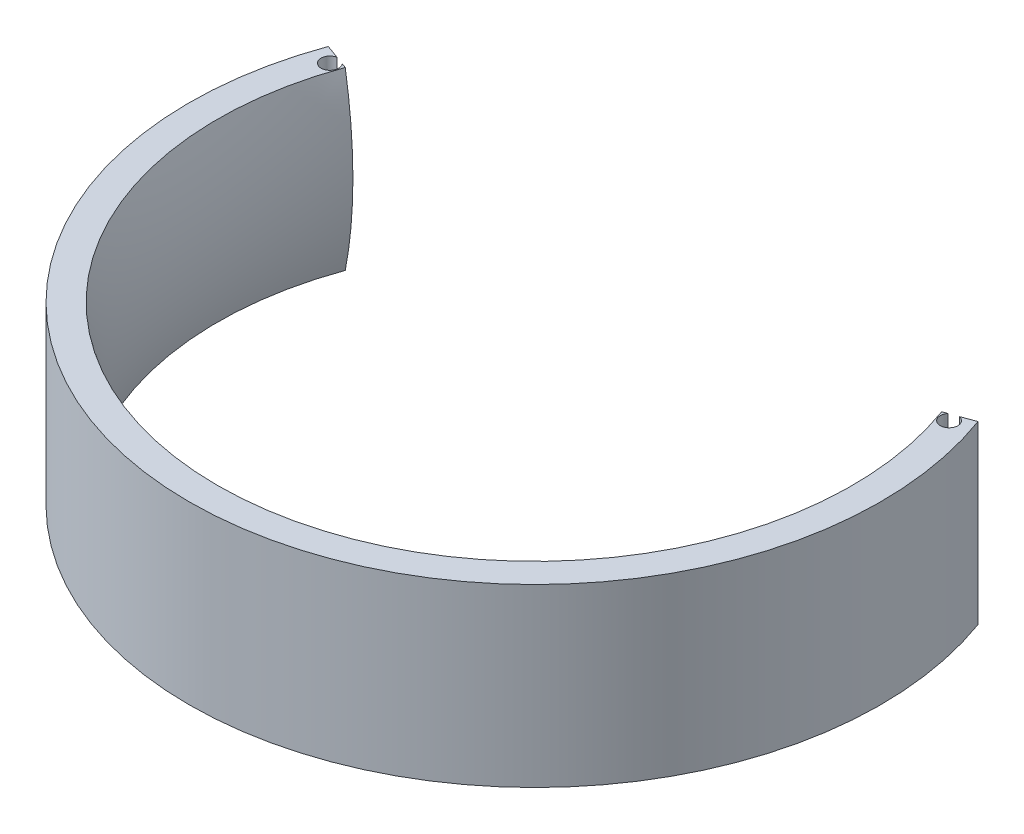
ISO-10303-21;
HEADER;
FILE_DESCRIPTION(('STEP AP214'),'2;1');
FILE_NAME('part.step','',(''),(''),'','','');
FILE_SCHEMA(('AUTOMOTIVE_DESIGN { 1 0 10303 214 1 1 1 1 }'));
ENDSEC;
DATA;
#1=APPLICATION_CONTEXT('core data for automotive mechanical design processes');
#2=APPLICATION_PROTOCOL_DEFINITION('international standard','automotive_design',2000,#1);
#3=PRODUCT_CONTEXT('',#1,'mechanical');
#4=PRODUCT('Part','Part','',(#3));
#5=PRODUCT_RELATED_PRODUCT_CATEGORY('part','',(#4));
#6=PRODUCT_DEFINITION_FORMATION('','',#4);
#7=PRODUCT_DEFINITION_CONTEXT('part definition',#1,'design');
#8=PRODUCT_DEFINITION('design','',#6,#7);
#9=PRODUCT_DEFINITION_SHAPE('','',#8);
#10=(LENGTH_UNIT() NAMED_UNIT(*) SI_UNIT(.MILLI.,.METRE.));
#11=(NAMED_UNIT(*) PLANE_ANGLE_UNIT() SI_UNIT($,.RADIAN.));
#12=(NAMED_UNIT(*) SI_UNIT($,.STERADIAN.) SOLID_ANGLE_UNIT());
#13=UNCERTAINTY_MEASURE_WITH_UNIT(LENGTH_MEASURE(1.E-05),#10,'distance_accuracy_value','');
#14=(GEOMETRIC_REPRESENTATION_CONTEXT(3) GLOBAL_UNCERTAINTY_ASSIGNED_CONTEXT((#13)) GLOBAL_UNIT_ASSIGNED_CONTEXT((#10,
#11,#12)) REPRESENTATION_CONTEXT('',''));
#15=CARTESIAN_POINT('',(0.,0.,0.));
#16=DIRECTION('',(0.,0.,1.));
#17=DIRECTION('',(1.,0.,0.));
#18=AXIS2_PLACEMENT_3D('',#15,#16,#17);
#19=CARTESIAN_POINT('',(-34.4526721427708,-10.,-12.5397471509011));
#20=DIRECTION('',(0.342020143325668,0.,-0.939692620785909));
#21=DIRECTION('',(-0.939692620785909,0.,-0.342020143325668));
#22=AXIS2_PLACEMENT_3D('',#19,#20,#21);
#23=PLANE('',#22);
#24=DIRECTION('',(-0.939692620785909,0.,-0.342020143325668));
#25=VECTOR('',#24,1.);
#26=CARTESIAN_POINT('',(-34.4526721427708,10.,-12.5397471509011));
#27=LINE('',#26,#25);
#28=CARTESIAN_POINT('',(-33.9229003109984,10.,-12.3469259731833));
#29=VERTEX_POINT('',#28);
#30=CARTESIAN_POINT('',(-34.4526721427708,10.,-12.5397471509011));
#31=VERTEX_POINT('',#30);
#32=EDGE_CURVE('E117',#29,#31,#27,.T.);
#33=ORIENTED_EDGE('',*,*,#32,.F.);
#34=CARTESIAN_POINT('',(-65.4411489814816,0.,-23.8186303254396));
#35=DIRECTION('',(0.342020143325673,0.,-0.939692620785907));
#36=DIRECTION('',(-0.939692620785907,0.,-0.342020143325673));
#37=AXIS2_PLACEMENT_3D('',#34,#35,#36);
#38=CIRCLE('',#37,35.);
#39=CARTESIAN_POINT('',(-33.9229003109983,-9.99999999999997,-12.3469259731833));
#40=VERTEX_POINT('',#39);
#41=EDGE_CURVE('E57',#29,#40,#38,.T.);
#42=ORIENTED_EDGE('',*,*,#41,.T.);
#43=DIRECTION('',(-0.939692620785909,0.,-0.342020143325668));
#44=VECTOR('',#43,1.);
#45=CARTESIAN_POINT('',(-34.4526721427708,-10.,-12.5397471509011));
#46=LINE('',#45,#44);
#47=CARTESIAN_POINT('',(-34.4526721427708,-10.,-12.5397471509011));
#48=VERTEX_POINT('',#47);
#49=EDGE_CURVE('E140',#40,#48,#46,.T.);
#50=ORIENTED_EDGE('',*,*,#49,.T.);
#51=DIRECTION('',(0.,1.,0.));
#52=VECTOR('',#51,1.);
#53=CARTESIAN_POINT('',(-34.4526721427708,-10.,-12.5397471509011));
#54=LINE('',#53,#52);
#55=EDGE_CURVE('E149',#48,#31,#54,.T.);
#56=ORIENTED_EDGE('',*,*,#55,.T.);
#57=EDGE_LOOP('',(#33,#42,#50,#56));
#58=FACE_BOUND('',#57,.T.);
#59=ADVANCED_FACE('F35',(#58),#23,.T.);
#60=CARTESIAN_POINT('',(32.8892417275068,-10.,-11.9707050163985));
#61=DIRECTION('',(-0.342020143325673,0.,-0.939692620785907));
#62=DIRECTION('',(-0.939692620785907,0.,0.342020143325673));
#63=AXIS2_PLACEMENT_3D('',#60,#61,#62);
#64=PLANE('',#63);
#65=DIRECTION('',(-0.939692620785907,0.,0.342020143325673));
#66=VECTOR('',#65,1.);
#67=CARTESIAN_POINT('',(32.8892417275068,-10.,-11.9707050163985));
#68=LINE('',#67,#66);
#69=CARTESIAN_POINT('',(34.4526721427708,-10.,-12.5397471509011));
#70=VERTEX_POINT('',#69);
#71=CARTESIAN_POINT('',(33.9229003109983,-10.,-12.3469259731833));
#72=VERTEX_POINT('',#71);
#73=EDGE_CURVE('E110',#70,#72,#68,.T.);
#74=ORIENTED_EDGE('',*,*,#73,.T.);
#75=CARTESIAN_POINT('',(65.4411489814816,0.,-23.8186303254396));
#76=DIRECTION('',(0.342020143325673,0.,0.939692620785907));
#77=DIRECTION('',(0.939692620785907,0.,-0.342020143325673));
#78=AXIS2_PLACEMENT_3D('',#75,#76,#77);
#79=CIRCLE('',#78,35.);
#80=CARTESIAN_POINT('',(33.9229003109984,10.,-12.3469259731833));
#81=VERTEX_POINT('',#80);
#82=EDGE_CURVE('E52',#81,#72,#79,.T.);
#83=ORIENTED_EDGE('',*,*,#82,.F.);
#84=DIRECTION('',(-0.939692620785907,0.,0.342020143325673));
#85=VECTOR('',#84,1.);
#86=CARTESIAN_POINT('',(32.8892417275068,10.,-11.9707050163985));
#87=LINE('',#86,#85);
#88=CARTESIAN_POINT('',(34.4526721427708,10.,-12.5397471509011));
#89=VERTEX_POINT('',#88);
#90=EDGE_CURVE('E108',#89,#81,#87,.T.);
#91=ORIENTED_EDGE('',*,*,#90,.F.);
#92=DIRECTION('',(0.,1.,0.));
#93=VECTOR('',#92,1.);
#94=CARTESIAN_POINT('',(34.4526721427708,-10.,-12.5397471509011));
#95=LINE('',#94,#93);
#96=EDGE_CURVE('E152',#70,#89,#95,.T.);
#97=ORIENTED_EDGE('',*,*,#96,.F.);
#98=EDGE_LOOP('',(#74,#83,#91,#97));
#99=FACE_BOUND('',#98,.T.);
#100=ADVANCED_FACE('F107',(#99),#64,.T.);
#101=CARTESIAN_POINT('',(0.,-10.,0.));
#102=DIRECTION('',(0.,-1.,0.));
#103=DIRECTION('',(0.,0.,-1.));
#104=AXIS2_PLACEMENT_3D('',#101,#102,#103);
#105=PLANE('',#104);
#106=ORIENTED_EDGE('',*,*,#49,.F.);
#107=CARTESIAN_POINT('',(0.,-9.99999999999997,0.));
#108=DIRECTION('',(0.,-1.,0.));
#109=DIRECTION('',(0.,0.,-1.));
#110=AXIS2_PLACEMENT_3D('',#107,#108,#109);
#111=CIRCLE('',#110,36.0999964888807);
#112=EDGE_CURVE('E165',#72,#40,#111,.T.);
#113=ORIENTED_EDGE('',*,*,#112,.F.);
#114=ORIENTED_EDGE('',*,*,#73,.F.);
#115=CARTESIAN_POINT('',(35.2187165858898,-10.,-11.8969595412146));
#116=DIRECTION('',(0.,-1.,0.));
#117=DIRECTION('',(0.,0.,1.));
#118=AXIS2_PLACEMENT_3D('',#115,#116,#117);
#119=CIRCLE('',#118,1.);
#120=CARTESIAN_POINT('',(35.3923647635567,-10.,-12.8817672942268));
#121=VERTEX_POINT('',#120);
#122=EDGE_CURVE('E136',#121,#70,#119,.T.);
#123=ORIENTED_EDGE('',*,*,#122,.F.);
#124=DIRECTION('',(-0.939692620785907,0.,0.342020143325672));
#125=VECTOR('',#124,1.);
#126=CARTESIAN_POINT('',(35.3923647635567,-10.,-12.8817672942268));
#127=LINE('',#126,#125);
#128=CARTESIAN_POINT('',(36.9557951788208,-10.,-13.4508094287294));
#129=VERTEX_POINT('',#128);
#130=EDGE_CURVE('E133',#129,#121,#127,.T.);
#131=ORIENTED_EDGE('',*,*,#130,.F.);
#132=CARTESIAN_POINT('',(0.,-10.,0.));
#133=DIRECTION('',(0.,1.,0.));
#134=DIRECTION('',(0.,0.,-1.));
#135=AXIS2_PLACEMENT_3D('',#132,#133,#134);
#136=CIRCLE('',#135,39.3275357934736);
#137=CARTESIAN_POINT('',(-36.9557951788208,-10.,-13.4508094287294));
#138=VERTEX_POINT('',#137);
#139=EDGE_CURVE('E130',#138,#129,#136,.T.);
#140=ORIENTED_EDGE('',*,*,#139,.F.);
#141=DIRECTION('',(-0.939692620785907,0.,-0.342020143325672));
#142=VECTOR('',#141,1.);
#143=CARTESIAN_POINT('',(-36.9557951788208,-10.,-13.4508094287294));
#144=LINE('',#143,#142);
#145=CARTESIAN_POINT('',(-35.3923647635567,-10.,-12.8817672942268));
#146=VERTEX_POINT('',#145);
#147=EDGE_CURVE('E145',#146,#138,#144,.T.);
#148=ORIENTED_EDGE('',*,*,#147,.F.);
#149=CARTESIAN_POINT('',(-35.2187165858898,-10.,-11.8969595412146));
#150=DIRECTION('',(0.,-1.,0.));
#151=DIRECTION('',(0.,0.,1.));
#152=AXIS2_PLACEMENT_3D('',#149,#150,#151);
#153=CIRCLE('',#152,1.);
#154=EDGE_CURVE('E142',#48,#146,#153,.T.);
#155=ORIENTED_EDGE('',*,*,#154,.F.);
#156=EDGE_LOOP('',(#106,#113,#114,#123,#131,#140,#148,#155));
#157=FACE_BOUND('',#156,.T.);
#158=ADVANCED_FACE('F172',(#157),#105,.T.);
#159=CARTESIAN_POINT('',(0.,10.,0.));
#160=DIRECTION('',(0.,-1.,0.));
#161=DIRECTION('',(0.,0.,-1.));
#162=AXIS2_PLACEMENT_3D('',#159,#160,#161);
#163=PLANE('',#162);
#164=CARTESIAN_POINT('',(0.,10.,0.));
#165=DIRECTION('',(0.,-1.,0.));
#166=DIRECTION('',(0.,0.,-1.));
#167=AXIS2_PLACEMENT_3D('',#164,#165,#166);
#168=CIRCLE('',#167,36.0999964888807);
#169=EDGE_CURVE('E97',#81,#29,#168,.T.);
#170=ORIENTED_EDGE('',*,*,#169,.T.);
#171=ORIENTED_EDGE('',*,*,#32,.T.);
#172=CARTESIAN_POINT('',(-35.2187165858898,10.,-11.8969595412146));
#173=DIRECTION('',(0.,-1.,0.));
#174=DIRECTION('',(0.,0.,1.));
#175=AXIS2_PLACEMENT_3D('',#172,#173,#174);
#176=CIRCLE('',#175,1.);
#177=CARTESIAN_POINT('',(-35.3923647635567,10.,-12.8817672942268));
#178=VERTEX_POINT('',#177);
#179=EDGE_CURVE('E119',#31,#178,#176,.T.);
#180=ORIENTED_EDGE('',*,*,#179,.T.);
#181=DIRECTION('',(-0.939692620785907,0.,-0.342020143325672));
#182=VECTOR('',#181,1.);
#183=CARTESIAN_POINT('',(-36.9557951788208,10.,-13.4508094287294));
#184=LINE('',#183,#182);
#185=CARTESIAN_POINT('',(-36.9557951788208,10.,-13.4508094287294));
#186=VERTEX_POINT('',#185);
#187=EDGE_CURVE('E127',#178,#186,#184,.T.);
#188=ORIENTED_EDGE('',*,*,#187,.T.);
#189=CARTESIAN_POINT('',(0.,10.,0.));
#190=DIRECTION('',(0.,1.,0.));
#191=DIRECTION('',(0.,0.,-1.));
#192=AXIS2_PLACEMENT_3D('',#189,#190,#191);
#193=CIRCLE('',#192,39.3275357934736);
#194=CARTESIAN_POINT('',(36.9557951788208,10.,-13.4508094287294));
#195=VERTEX_POINT('',#194);
#196=EDGE_CURVE('E102',#186,#195,#193,.T.);
#197=ORIENTED_EDGE('',*,*,#196,.T.);
#198=DIRECTION('',(-0.939692620785907,0.,0.342020143325672));
#199=VECTOR('',#198,1.);
#200=CARTESIAN_POINT('',(35.3923647635567,10.,-12.8817672942268));
#201=LINE('',#200,#199);
#202=CARTESIAN_POINT('',(35.3923647635567,10.,-12.8817672942268));
#203=VERTEX_POINT('',#202);
#204=EDGE_CURVE('E121',#195,#203,#201,.T.);
#205=ORIENTED_EDGE('',*,*,#204,.T.);
#206=CARTESIAN_POINT('',(35.2187165858898,10.,-11.8969595412146));
#207=DIRECTION('',(0.,-1.,0.));
#208=DIRECTION('',(0.,0.,1.));
#209=AXIS2_PLACEMENT_3D('',#206,#207,#208);
#210=CIRCLE('',#209,1.);
#211=EDGE_CURVE('E116',#203,#89,#210,.T.);
#212=ORIENTED_EDGE('',*,*,#211,.T.);
#213=ORIENTED_EDGE('',*,*,#90,.T.);
#214=EDGE_LOOP('',(#170,#171,#180,#188,#197,#205,#212,#213));
#215=FACE_BOUND('',#214,.T.);
#216=ADVANCED_FACE('F113',(#215),#163,.F.);
#217=CARTESIAN_POINT('',(0.,-10.,0.));
#218=DIRECTION('',(0.,1.,0.));
#219=DIRECTION('',(0.,0.,1.));
#220=AXIS2_PLACEMENT_3D('',#217,#218,#219);
#221=CYLINDRICAL_SURFACE('',#220,39.3275357934736);
#222=DIRECTION('',(0.,1.,0.));
#223=VECTOR('',#222,1.);
#224=CARTESIAN_POINT('',(36.9557951788208,-10.,-13.4508094287294));
#225=LINE('',#224,#223);
#226=EDGE_CURVE('E39',#129,#195,#225,.T.);
#227=ORIENTED_EDGE('',*,*,#226,.T.);
#228=ORIENTED_EDGE('',*,*,#196,.F.);
#229=DIRECTION('',(0.,1.,0.));
#230=VECTOR('',#229,1.);
#231=CARTESIAN_POINT('',(-36.9557951788208,-10.,-13.4508094287294));
#232=LINE('',#231,#230);
#233=EDGE_CURVE('E11',#138,#186,#232,.T.);
#234=ORIENTED_EDGE('',*,*,#233,.F.);
#235=ORIENTED_EDGE('',*,*,#139,.T.);
#236=EDGE_LOOP('',(#227,#228,#234,#235));
#237=FACE_BOUND('',#236,.T.);
#238=ADVANCED_FACE('F37',(#237),#221,.T.);
#239=CARTESIAN_POINT('',(-36.9557951788208,-10.,-13.4508094287294));
#240=DIRECTION('',(0.342020143325672,0.,-0.939692620785907));
#241=DIRECTION('',(-0.939692620785907,0.,-0.342020143325672));
#242=AXIS2_PLACEMENT_3D('',#239,#240,#241);
#243=PLANE('',#242);
#244=ORIENTED_EDGE('',*,*,#233,.T.);
#245=ORIENTED_EDGE('',*,*,#187,.F.);
#246=DIRECTION('',(0.,1.,0.));
#247=VECTOR('',#246,1.);
#248=CARTESIAN_POINT('',(-35.3923647635567,-10.,-12.8817672942268));
#249=LINE('',#248,#247);
#250=EDGE_CURVE('E44',#146,#178,#249,.T.);
#251=ORIENTED_EDGE('',*,*,#250,.F.);
#252=ORIENTED_EDGE('',*,*,#147,.T.);
#253=EDGE_LOOP('',(#244,#245,#251,#252));
#254=FACE_BOUND('',#253,.T.);
#255=ADVANCED_FACE('F178',(#254),#243,.T.);
#256=CARTESIAN_POINT('',(-35.2187165858898,-10.,-11.8969595412146));
#257=DIRECTION('',(0.,1.,0.));
#258=DIRECTION('',(0.,0.,1.));
#259=AXIS2_PLACEMENT_3D('',#256,#257,#258);
#260=CYLINDRICAL_SURFACE('',#259,1.);
#261=ORIENTED_EDGE('',*,*,#250,.T.);
#262=ORIENTED_EDGE('',*,*,#179,.F.);
#263=ORIENTED_EDGE('',*,*,#55,.F.);
#264=ORIENTED_EDGE('',*,*,#154,.T.);
#265=EDGE_LOOP('',(#261,#262,#263,#264));
#266=FACE_BOUND('',#265,.T.);
#267=ADVANCED_FACE('F175',(#266),#260,.F.);
#268=CARTESIAN_POINT('',(35.2187165858898,-10.,-11.8969595412146));
#269=DIRECTION('',(0.,1.,0.));
#270=DIRECTION('',(0.,0.,1.));
#271=AXIS2_PLACEMENT_3D('',#268,#269,#270);
#272=CYLINDRICAL_SURFACE('',#271,1.);
#273=ORIENTED_EDGE('',*,*,#96,.T.);
#274=ORIENTED_EDGE('',*,*,#211,.F.);
#275=DIRECTION('',(0.,1.,0.));
#276=VECTOR('',#275,1.);
#277=CARTESIAN_POINT('',(35.3923647635567,-10.,-12.8817672942268));
#278=LINE('',#277,#276);
#279=EDGE_CURVE('E153',#121,#203,#278,.T.);
#280=ORIENTED_EDGE('',*,*,#279,.F.);
#281=ORIENTED_EDGE('',*,*,#122,.T.);
#282=EDGE_LOOP('',(#273,#274,#280,#281));
#283=FACE_BOUND('',#282,.T.);
#284=ADVANCED_FACE('F181',(#283),#272,.F.);
#285=CARTESIAN_POINT('',(35.3923647635567,-10.,-12.8817672942268));
#286=DIRECTION('',(-0.342020143325672,0.,-0.939692620785907));
#287=DIRECTION('',(-0.939692620785907,0.,0.342020143325672));
#288=AXIS2_PLACEMENT_3D('',#285,#286,#287);
#289=PLANE('',#288);
#290=ORIENTED_EDGE('',*,*,#279,.T.);
#291=ORIENTED_EDGE('',*,*,#204,.F.);
#292=ORIENTED_EDGE('',*,*,#226,.F.);
#293=ORIENTED_EDGE('',*,*,#130,.T.);
#294=EDGE_LOOP('',(#290,#291,#292,#293));
#295=FACE_BOUND('',#294,.T.);
#296=ADVANCED_FACE('F161',(#295),#289,.T.);
#297=CARTESIAN_POINT('',(0.,0.,0.));
#298=DIRECTION('',(0.,-1.,0.));
#299=DIRECTION('',(0.,0.,-1.));
#300=AXIS2_PLACEMENT_3D('',#297,#298,#299);
#301=TOROIDAL_SURFACE('',#300,69.6410161513776,35.);
#302=ORIENTED_EDGE('',*,*,#169,.F.);
#303=ORIENTED_EDGE('',*,*,#82,.T.);
#304=ORIENTED_EDGE('',*,*,#112,.T.);
#305=ORIENTED_EDGE('',*,*,#41,.F.);
#306=EDGE_LOOP('',(#302,#303,#304,#305));
#307=FACE_BOUND('',#306,.T.);
#308=ADVANCED_FACE('F98',(#307),#301,.T.);
#309=CLOSED_SHELL('',(#59,#100,#158,#216,#238,#255,#267,#284,#296,#308));
#310=MANIFOLD_SOLID_BREP('B2',#309);
#311=ADVANCED_BREP_SHAPE_REPRESENTATION('',(#18,#310),#14);
#312=SHAPE_DEFINITION_REPRESENTATION(#9,#311);
ENDSEC;
END-ISO-10303-21;
